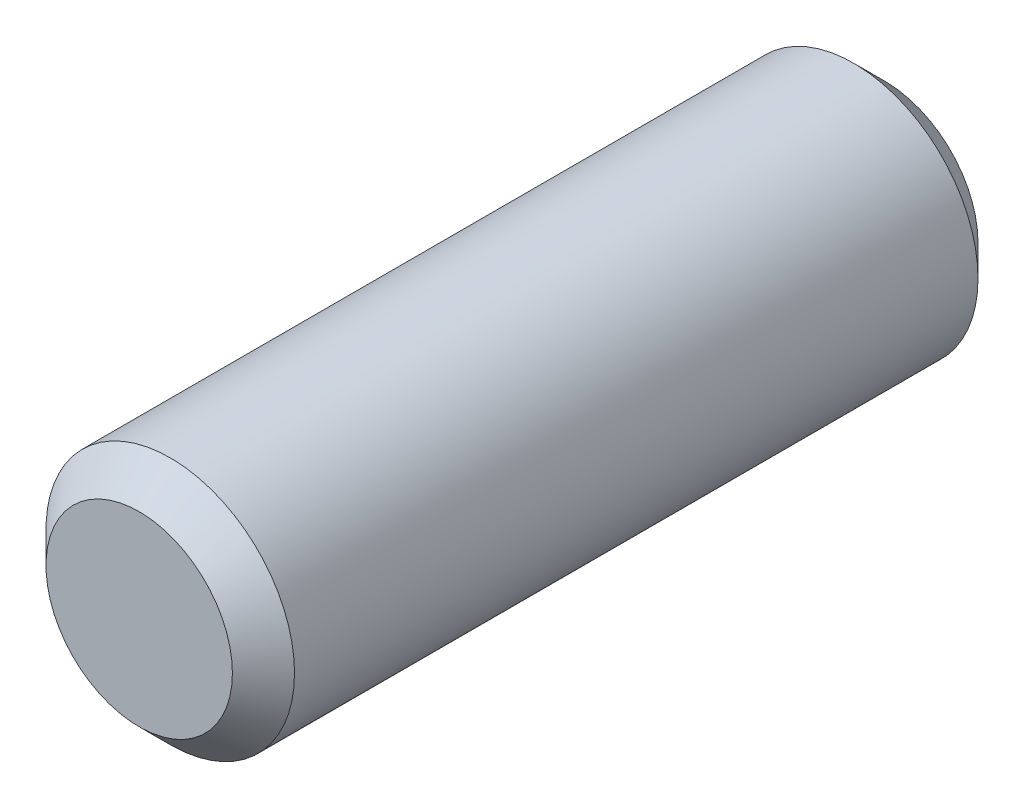
ISO-10303-21;
HEADER;
FILE_DESCRIPTION(('STEP AP214'),'2;1');
FILE_NAME('part.step','',(''),(''),'','','');
FILE_SCHEMA(('AUTOMOTIVE_DESIGN { 1 0 10303 214 1 1 1 1 }'));
ENDSEC;
DATA;
#1=APPLICATION_CONTEXT('core data for automotive mechanical design processes');
#2=APPLICATION_PROTOCOL_DEFINITION('international standard','automotive_design',2000,#1);
#3=PRODUCT_CONTEXT('',#1,'mechanical');
#4=PRODUCT('Part','Part','',(#3));
#5=PRODUCT_RELATED_PRODUCT_CATEGORY('part','',(#4));
#6=PRODUCT_DEFINITION_FORMATION('','',#4);
#7=PRODUCT_DEFINITION_CONTEXT('part definition',#1,'design');
#8=PRODUCT_DEFINITION('design','',#6,#7);
#9=PRODUCT_DEFINITION_SHAPE('','',#8);
#10=(LENGTH_UNIT() NAMED_UNIT(*) SI_UNIT(.MILLI.,.METRE.));
#11=(NAMED_UNIT(*) PLANE_ANGLE_UNIT() SI_UNIT($,.RADIAN.));
#12=(NAMED_UNIT(*) SI_UNIT($,.STERADIAN.) SOLID_ANGLE_UNIT());
#13=UNCERTAINTY_MEASURE_WITH_UNIT(LENGTH_MEASURE(1.E-05),#10,'distance_accuracy_value','');
#14=(GEOMETRIC_REPRESENTATION_CONTEXT(3) GLOBAL_UNCERTAINTY_ASSIGNED_CONTEXT((#13)) GLOBAL_UNIT_ASSIGNED_CONTEXT((#10,
#11,#12)) REPRESENTATION_CONTEXT('',''));
#15=CARTESIAN_POINT('',(0.,0.,0.));
#16=DIRECTION('',(0.,0.,1.));
#17=DIRECTION('',(1.,0.,0.));
#18=AXIS2_PLACEMENT_3D('',#15,#16,#17);
#19=CARTESIAN_POINT('',(0.,0.,12.));
#20=DIRECTION('',(0.,0.,-1.));
#21=DIRECTION('',(-1.,0.,0.));
#22=AXIS2_PLACEMENT_3D('',#19,#20,#21);
#23=CYLINDRICAL_SURFACE('',#22,4.);
#24=CARTESIAN_POINT('',(0.,0.,-11.));
#25=DIRECTION('',(0.,0.,1.));
#26=DIRECTION('',(1.,0.,0.));
#27=AXIS2_PLACEMENT_3D('',#24,#25,#26);
#28=CIRCLE('',#27,4.);
#29=CARTESIAN_POINT('',(4.,0.,-11.));
#30=VERTEX_POINT('',#29);
#31=EDGE_CURVE('E51',#30,#30,#28,.T.);
#32=ORIENTED_EDGE('',*,*,#31,.T.);
#33=EDGE_LOOP('',(#32));
#34=FACE_BOUND('',#33,.T.);
#35=CARTESIAN_POINT('',(0.,0.,11.));
#36=DIRECTION('',(0.,0.,1.));
#37=DIRECTION('',(1.,0.,0.));
#38=AXIS2_PLACEMENT_3D('',#35,#36,#37);
#39=CIRCLE('',#38,4.);
#40=CARTESIAN_POINT('',(4.,0.,11.));
#41=VERTEX_POINT('',#40);
#42=EDGE_CURVE('E55',#41,#41,#39,.F.);
#43=ORIENTED_EDGE('',*,*,#42,.T.);
#44=EDGE_LOOP('',(#43));
#45=FACE_BOUND('',#44,.T.);
#46=ADVANCED_FACE('F39',(#34,#45),#23,.T.);
#47=CARTESIAN_POINT('',(0.,0.,12.));
#48=DIRECTION('',(0.,0.,1.));
#49=DIRECTION('',(1.,0.,0.));
#50=AXIS2_PLACEMENT_3D('',#47,#48,#49);
#51=PLANE('',#50);
#52=CARTESIAN_POINT('',(0.,0.,12.));
#53=DIRECTION('',(0.,0.,1.));
#54=DIRECTION('',(1.,0.,0.));
#55=AXIS2_PLACEMENT_3D('',#52,#53,#54);
#56=CIRCLE('',#55,3.);
#57=CARTESIAN_POINT('',(3.,0.,12.));
#58=VERTEX_POINT('',#57);
#59=EDGE_CURVE('E10',#58,#58,#56,.T.);
#60=ORIENTED_EDGE('',*,*,#59,.T.);
#61=EDGE_LOOP('',(#60));
#62=FACE_BOUND('',#61,.T.);
#63=ADVANCED_FACE('F71',(#62),#51,.T.);
#64=CARTESIAN_POINT('',(0.,0.,-12.));
#65=DIRECTION('',(0.,0.,1.));
#66=DIRECTION('',(1.,0.,0.));
#67=AXIS2_PLACEMENT_3D('',#64,#65,#66);
#68=PLANE('',#67);
#69=CARTESIAN_POINT('',(0.,0.,-12.));
#70=DIRECTION('',(0.,0.,1.));
#71=DIRECTION('',(1.,0.,0.));
#72=AXIS2_PLACEMENT_3D('',#69,#70,#71);
#73=CIRCLE('',#72,3.);
#74=CARTESIAN_POINT('',(3.,0.,-12.));
#75=VERTEX_POINT('',#74);
#76=EDGE_CURVE('E47',#75,#75,#73,.F.);
#77=ORIENTED_EDGE('',*,*,#76,.T.);
#78=EDGE_LOOP('',(#77));
#79=FACE_BOUND('',#78,.T.);
#80=ADVANCED_FACE('F68',(#79),#68,.F.);
#81=CARTESIAN_POINT('',(0.,0.,-11.));
#82=DIRECTION('',(0.,0.,1.));
#83=DIRECTION('',(1.,0.,0.));
#84=AXIS2_PLACEMENT_3D('',#81,#82,#83);
#85=CONICAL_SURFACE('',#84,4.,0.78539816339745);
#86=ORIENTED_EDGE('',*,*,#76,.F.);
#87=EDGE_LOOP('',(#86));
#88=FACE_BOUND('',#87,.T.);
#89=ORIENTED_EDGE('',*,*,#31,.F.);
#90=EDGE_LOOP('',(#89));
#91=FACE_BOUND('',#90,.T.);
#92=ADVANCED_FACE('F64',(#88,#91),#85,.T.);
#93=CARTESIAN_POINT('',(0.,0.,12.));
#94=DIRECTION('',(0.,0.,-1.));
#95=DIRECTION('',(-1.,0.,0.));
#96=AXIS2_PLACEMENT_3D('',#93,#94,#95);
#97=CONICAL_SURFACE('',#96,3.,0.785398163397447);
#98=ORIENTED_EDGE('',*,*,#42,.F.);
#99=EDGE_LOOP('',(#98));
#100=FACE_BOUND('',#99,.T.);
#101=ORIENTED_EDGE('',*,*,#59,.F.);
#102=EDGE_LOOP('',(#101));
#103=FACE_BOUND('',#102,.T.);
#104=ADVANCED_FACE('F42',(#100,#103),#97,.T.);
#105=CLOSED_SHELL('',(#46,#63,#80,#92,#104));
#106=MANIFOLD_SOLID_BREP('B2',#105);
#107=ADVANCED_BREP_SHAPE_REPRESENTATION('',(#18,#106),#14);
#108=SHAPE_DEFINITION_REPRESENTATION(#9,#107);
ENDSEC;
END-ISO-10303-21;
